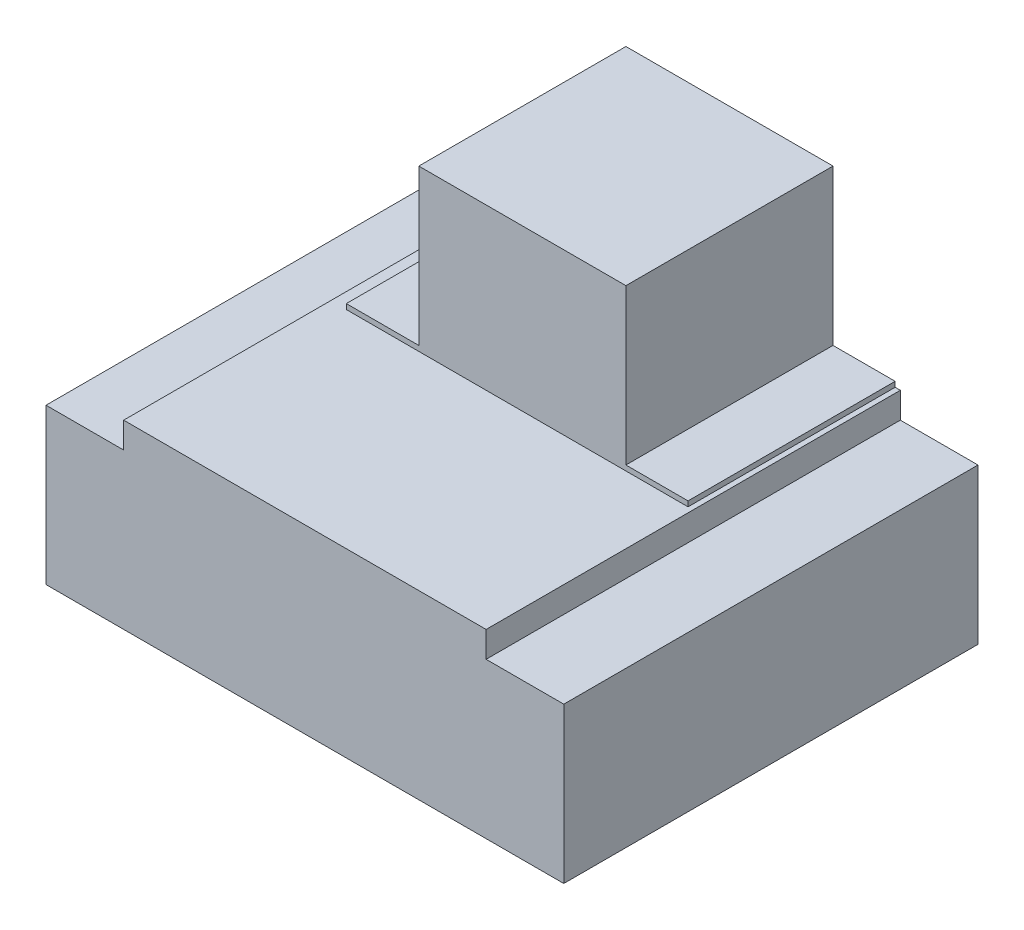
ISO-10303-21;
HEADER;
FILE_DESCRIPTION(('STEP AP214'),'2;1');
FILE_NAME('part.step','',(''),(''),'','','');
FILE_SCHEMA(('AUTOMOTIVE_DESIGN { 1 0 10303 214 1 1 1 1 }'));
ENDSEC;
DATA;
#1=APPLICATION_CONTEXT('core data for automotive mechanical design processes');
#2=APPLICATION_PROTOCOL_DEFINITION('international standard','automotive_design',2000,#1);
#3=PRODUCT_CONTEXT('',#1,'mechanical');
#4=PRODUCT('Part','Part','',(#3));
#5=PRODUCT_RELATED_PRODUCT_CATEGORY('part','',(#4));
#6=PRODUCT_DEFINITION_FORMATION('','',#4);
#7=PRODUCT_DEFINITION_CONTEXT('part definition',#1,'design');
#8=PRODUCT_DEFINITION('design','',#6,#7);
#9=PRODUCT_DEFINITION_SHAPE('','',#8);
#10=(LENGTH_UNIT() NAMED_UNIT(*) SI_UNIT(.MILLI.,.METRE.));
#11=(NAMED_UNIT(*) PLANE_ANGLE_UNIT() SI_UNIT($,.RADIAN.));
#12=(NAMED_UNIT(*) SI_UNIT($,.STERADIAN.) SOLID_ANGLE_UNIT());
#13=UNCERTAINTY_MEASURE_WITH_UNIT(LENGTH_MEASURE(1.E-05),#10,'distance_accuracy_value','');
#14=(GEOMETRIC_REPRESENTATION_CONTEXT(3) GLOBAL_UNCERTAINTY_ASSIGNED_CONTEXT((#13)) GLOBAL_UNIT_ASSIGNED_CONTEXT((#10,
#11,#12)) REPRESENTATION_CONTEXT('',''));
#15=CARTESIAN_POINT('',(0.,0.,0.));
#16=DIRECTION('',(0.,0.,1.));
#17=DIRECTION('',(1.,0.,0.));
#18=AXIS2_PLACEMENT_3D('',#15,#16,#17);
#19=CARTESIAN_POINT('',(0.,35.,0.));
#20=DIRECTION('',(1.,0.,0.));
#21=DIRECTION('',(0.,0.,-1.));
#22=AXIS2_PLACEMENT_3D('',#19,#20,#21);
#23=PLANE('',#22);
#24=DIRECTION('',(0.,0.,1.));
#25=VECTOR('',#24,1.);
#26=CARTESIAN_POINT('',(0.,30.,-80.));
#27=LINE('',#26,#25);
#28=CARTESIAN_POINT('',(0.,30.,-80.));
#29=VERTEX_POINT('',#28);
#30=CARTESIAN_POINT('',(0.,30.,0.));
#31=VERTEX_POINT('',#30);
#32=EDGE_CURVE('E145',#29,#31,#27,.T.);
#33=ORIENTED_EDGE('',*,*,#32,.F.);
#34=DIRECTION('',(0.,-1.,0.));
#35=VECTOR('',#34,1.);
#36=CARTESIAN_POINT('',(0.,35.,-80.));
#37=LINE('',#36,#35);
#38=CARTESIAN_POINT('',(0.,0.,-80.));
#39=VERTEX_POINT('',#38);
#40=EDGE_CURVE('E167',#29,#39,#37,.T.);
#41=ORIENTED_EDGE('',*,*,#40,.T.);
#42=DIRECTION('',(0.,0.,1.));
#43=VECTOR('',#42,1.);
#44=CARTESIAN_POINT('',(0.,0.,0.));
#45=LINE('',#44,#43);
#46=CARTESIAN_POINT('',(0.,0.,0.));
#47=VERTEX_POINT('',#46);
#48=EDGE_CURVE('E166',#39,#47,#45,.T.);
#49=ORIENTED_EDGE('',*,*,#48,.T.);
#50=DIRECTION('',(0.,-1.,0.));
#51=VECTOR('',#50,1.);
#52=CARTESIAN_POINT('',(0.,35.,0.));
#53=LINE('',#52,#51);
#54=EDGE_CURVE('E11',#31,#47,#53,.T.);
#55=ORIENTED_EDGE('',*,*,#54,.F.);
#56=EDGE_LOOP('',(#33,#41,#49,#55));
#57=FACE_BOUND('',#56,.T.);
#58=ADVANCED_FACE('F35',(#57),#23,.F.);
#59=CARTESIAN_POINT('',(0.,36.,0.));
#60=DIRECTION('',(0.,1.,0.));
#61=DIRECTION('',(0.,0.,1.));
#62=AXIS2_PLACEMENT_3D('',#59,#60,#61);
#63=PLANE('',#62);
#64=DIRECTION('',(0.,0.,1.));
#65=VECTOR('',#64,1.);
#66=CARTESIAN_POINT('',(32.,36.,-80.));
#67=LINE('',#66,#65);
#68=CARTESIAN_POINT('',(32.,36.,-80.));
#69=VERTEX_POINT('',#68);
#70=CARTESIAN_POINT('',(32.,36.,-40.));
#71=VERTEX_POINT('',#70);
#72=EDGE_CURVE('E229',#69,#71,#67,.T.);
#73=ORIENTED_EDGE('',*,*,#72,.F.);
#74=DIRECTION('',(-1.,0.,0.));
#75=VECTOR('',#74,1.);
#76=CARTESIAN_POINT('',(18.,36.,-80.));
#77=LINE('',#76,#75);
#78=CARTESIAN_POINT('',(18.,36.,-80.));
#79=VERTEX_POINT('',#78);
#80=EDGE_CURVE('E256',#69,#79,#77,.T.);
#81=ORIENTED_EDGE('',*,*,#80,.T.);
#82=DIRECTION('',(0.,0.,1.));
#83=VECTOR('',#82,1.);
#84=CARTESIAN_POINT('',(18.,36.,-80.));
#85=LINE('',#84,#83);
#86=CARTESIAN_POINT('',(18.,36.,-40.));
#87=VERTEX_POINT('',#86);
#88=EDGE_CURVE('E247',#79,#87,#85,.T.);
#89=ORIENTED_EDGE('',*,*,#88,.T.);
#90=DIRECTION('',(1.,0.,0.));
#91=VECTOR('',#90,1.);
#92=CARTESIAN_POINT('',(18.,36.,-40.));
#93=LINE('',#92,#91);
#94=EDGE_CURVE('E252',#87,#71,#93,.T.);
#95=ORIENTED_EDGE('',*,*,#94,.T.);
#96=EDGE_LOOP('',(#73,#81,#89,#95));
#97=FACE_BOUND('',#96,.T.);
#98=ADVANCED_FACE('F306',(#97),#63,.T.);
#99=CARTESIAN_POINT('',(0.,35.,0.));
#100=DIRECTION('',(0.,-1.,0.));
#101=DIRECTION('',(0.,0.,-1.));
#102=AXIS2_PLACEMENT_3D('',#99,#100,#101);
#103=PLANE('',#102);
#104=DIRECTION('',(-1.,0.,0.));
#105=VECTOR('',#104,1.);
#106=CARTESIAN_POINT('',(0.,35.,-80.));
#107=LINE('',#106,#105);
#108=CARTESIAN_POINT('',(18.,35.,-80.));
#109=VERTEX_POINT('',#108);
#110=CARTESIAN_POINT('',(15.,35.,-80.));
#111=VERTEX_POINT('',#110);
#112=EDGE_CURVE('E274',#109,#111,#107,.T.);
#113=ORIENTED_EDGE('',*,*,#112,.T.);
#114=DIRECTION('',(0.,0.,-1.));
#115=VECTOR('',#114,1.);
#116=CARTESIAN_POINT('',(15.,35.,-80.));
#117=LINE('',#116,#115);
#118=CARTESIAN_POINT('',(15.,35.,0.));
#119=VERTEX_POINT('',#118);
#120=EDGE_CURVE('E155',#119,#111,#117,.T.);
#121=ORIENTED_EDGE('',*,*,#120,.F.);
#122=DIRECTION('',(1.,0.,0.));
#123=VECTOR('',#122,1.);
#124=CARTESIAN_POINT('',(0.,35.,0.));
#125=LINE('',#124,#123);
#126=CARTESIAN_POINT('',(85.,35.,0.));
#127=VERTEX_POINT('',#126);
#128=EDGE_CURVE('E187',#119,#127,#125,.T.);
#129=ORIENTED_EDGE('',*,*,#128,.T.);
#130=DIRECTION('',(0.,0.,1.));
#131=VECTOR('',#130,1.);
#132=CARTESIAN_POINT('',(85.,35.,-80.));
#133=LINE('',#132,#131);
#134=CARTESIAN_POINT('',(85.,35.,-80.));
#135=VERTEX_POINT('',#134);
#136=EDGE_CURVE('E208',#135,#127,#133,.T.);
#137=ORIENTED_EDGE('',*,*,#136,.F.);
#138=CARTESIAN_POINT('',(84.,35.,-80.));
#139=VERTEX_POINT('',#138);
#140=EDGE_CURVE('E180',#135,#139,#107,.T.);
#141=ORIENTED_EDGE('',*,*,#140,.T.);
#142=DIRECTION('',(0.,0.,-1.));
#143=VECTOR('',#142,1.);
#144=CARTESIAN_POINT('',(84.,35.,-80.));
#145=LINE('',#144,#143);
#146=CARTESIAN_POINT('',(84.,35.,-40.));
#147=VERTEX_POINT('',#146);
#148=EDGE_CURVE('E251',#147,#139,#145,.T.);
#149=ORIENTED_EDGE('',*,*,#148,.F.);
#150=DIRECTION('',(1.,0.,0.));
#151=VECTOR('',#150,1.);
#152=CARTESIAN_POINT('',(18.,35.,-40.));
#153=LINE('',#152,#151);
#154=CARTESIAN_POINT('',(18.,35.,-40.));
#155=VERTEX_POINT('',#154);
#156=EDGE_CURVE('E262',#155,#147,#153,.T.);
#157=ORIENTED_EDGE('',*,*,#156,.F.);
#158=DIRECTION('',(0.,0.,1.));
#159=VECTOR('',#158,1.);
#160=CARTESIAN_POINT('',(18.,35.,-80.));
#161=LINE('',#160,#159);
#162=EDGE_CURVE('E246',#109,#155,#161,.T.);
#163=ORIENTED_EDGE('',*,*,#162,.F.);
#164=EDGE_LOOP('',(#113,#121,#129,#137,#141,#149,#157,#163));
#165=FACE_BOUND('',#164,.T.);
#166=ADVANCED_FACE('F280',(#165),#103,.F.);
#167=CARTESIAN_POINT('',(0.,35.,0.));
#168=DIRECTION('',(0.,0.,-1.));
#169=DIRECTION('',(-1.,0.,0.));
#170=AXIS2_PLACEMENT_3D('',#167,#168,#169);
#171=PLANE('',#170);
#172=ORIENTED_EDGE('',*,*,#128,.F.);
#173=DIRECTION('',(0.,1.,0.));
#174=VECTOR('',#173,1.);
#175=CARTESIAN_POINT('',(15.,30.,0.));
#176=LINE('',#175,#174);
#177=CARTESIAN_POINT('',(15.,30.,0.));
#178=VERTEX_POINT('',#177);
#179=EDGE_CURVE('E162',#178,#119,#176,.T.);
#180=ORIENTED_EDGE('',*,*,#179,.F.);
#181=DIRECTION('',(1.,0.,0.));
#182=VECTOR('',#181,1.);
#183=CARTESIAN_POINT('',(0.,30.,0.));
#184=LINE('',#183,#182);
#185=EDGE_CURVE('E148',#31,#178,#184,.T.);
#186=ORIENTED_EDGE('',*,*,#185,.F.);
#187=ORIENTED_EDGE('',*,*,#54,.T.);
#188=DIRECTION('',(1.,0.,0.));
#189=VECTOR('',#188,1.);
#190=CARTESIAN_POINT('',(0.,0.,0.));
#191=LINE('',#190,#189);
#192=CARTESIAN_POINT('',(100.,0.,0.));
#193=VERTEX_POINT('',#192);
#194=EDGE_CURVE('E171',#47,#193,#191,.T.);
#195=ORIENTED_EDGE('',*,*,#194,.T.);
#196=DIRECTION('',(0.,-1.,0.));
#197=VECTOR('',#196,1.);
#198=CARTESIAN_POINT('',(100.,35.,0.));
#199=LINE('',#198,#197);
#200=CARTESIAN_POINT('',(100.,30.,0.));
#201=VERTEX_POINT('',#200);
#202=EDGE_CURVE('E42',#201,#193,#199,.T.);
#203=ORIENTED_EDGE('',*,*,#202,.F.);
#204=DIRECTION('',(1.,0.,0.));
#205=VECTOR('',#204,1.);
#206=CARTESIAN_POINT('',(100.,30.,0.));
#207=LINE('',#206,#205);
#208=CARTESIAN_POINT('',(85.,30.,0.));
#209=VERTEX_POINT('',#208);
#210=EDGE_CURVE('E206',#209,#201,#207,.T.);
#211=ORIENTED_EDGE('',*,*,#210,.F.);
#212=DIRECTION('',(0.,1.,0.));
#213=VECTOR('',#212,1.);
#214=CARTESIAN_POINT('',(85.,30.,0.));
#215=LINE('',#214,#213);
#216=EDGE_CURVE('E214',#209,#127,#215,.T.);
#217=ORIENTED_EDGE('',*,*,#216,.T.);
#218=EDGE_LOOP('',(#172,#180,#186,#187,#195,#203,#211,#217));
#219=FACE_BOUND('',#218,.T.);
#220=ADVANCED_FACE('F159',(#219),#171,.F.);
#221=CARTESIAN_POINT('',(100.,35.,0.));
#222=DIRECTION('',(-1.,0.,0.));
#223=DIRECTION('',(0.,0.,1.));
#224=AXIS2_PLACEMENT_3D('',#221,#222,#223);
#225=PLANE('',#224);
#226=DIRECTION('',(0.,-1.,0.));
#227=VECTOR('',#226,1.);
#228=CARTESIAN_POINT('',(100.,35.,-80.));
#229=LINE('',#228,#227);
#230=CARTESIAN_POINT('',(100.,30.,-80.));
#231=VERTEX_POINT('',#230);
#232=CARTESIAN_POINT('',(100.,0.,-80.));
#233=VERTEX_POINT('',#232);
#234=EDGE_CURVE('E189',#231,#233,#229,.T.);
#235=ORIENTED_EDGE('',*,*,#234,.F.);
#236=DIRECTION('',(0.,0.,-1.));
#237=VECTOR('',#236,1.);
#238=CARTESIAN_POINT('',(100.,30.,-80.));
#239=LINE('',#238,#237);
#240=EDGE_CURVE('E57',#201,#231,#239,.T.);
#241=ORIENTED_EDGE('',*,*,#240,.F.);
#242=ORIENTED_EDGE('',*,*,#202,.T.);
#243=DIRECTION('',(0.,0.,-1.));
#244=VECTOR('',#243,1.);
#245=CARTESIAN_POINT('',(100.,0.,0.));
#246=LINE('',#245,#244);
#247=EDGE_CURVE('E174',#193,#233,#246,.T.);
#248=ORIENTED_EDGE('',*,*,#247,.T.);
#249=EDGE_LOOP('',(#235,#241,#242,#248));
#250=FACE_BOUND('',#249,.T.);
#251=ADVANCED_FACE('F193',(#250),#225,.F.);
#252=CARTESIAN_POINT('',(0.,35.,-80.));
#253=DIRECTION('',(0.,0.,1.));
#254=DIRECTION('',(1.,0.,0.));
#255=AXIS2_PLACEMENT_3D('',#252,#253,#254);
#256=PLANE('',#255);
#257=DIRECTION('',(-1.,0.,0.));
#258=VECTOR('',#257,1.);
#259=CARTESIAN_POINT('',(0.,30.,-80.));
#260=LINE('',#259,#258);
#261=CARTESIAN_POINT('',(15.,30.,-80.));
#262=VERTEX_POINT('',#261);
#263=EDGE_CURVE('E151',#262,#29,#260,.T.);
#264=ORIENTED_EDGE('',*,*,#263,.F.);
#265=DIRECTION('',(0.,1.,0.));
#266=VECTOR('',#265,1.);
#267=CARTESIAN_POINT('',(15.,30.,-80.));
#268=LINE('',#267,#266);
#269=EDGE_CURVE('E232',#262,#111,#268,.T.);
#270=ORIENTED_EDGE('',*,*,#269,.T.);
#271=ORIENTED_EDGE('',*,*,#112,.F.);
#272=DIRECTION('',(0.,-1.,0.));
#273=VECTOR('',#272,1.);
#274=CARTESIAN_POINT('',(18.,36.,-80.));
#275=LINE('',#274,#273);
#276=EDGE_CURVE('E259',#79,#109,#275,.T.);
#277=ORIENTED_EDGE('',*,*,#276,.F.);
#278=ORIENTED_EDGE('',*,*,#80,.F.);
#279=DIRECTION('',(0.,-1.,0.));
#280=VECTOR('',#279,1.);
#281=CARTESIAN_POINT('',(32.,66.,-80.));
#282=LINE('',#281,#280);
#283=CARTESIAN_POINT('',(32.,66.,-80.));
#284=VERTEX_POINT('',#283);
#285=EDGE_CURVE('E228',#284,#69,#282,.T.);
#286=ORIENTED_EDGE('',*,*,#285,.F.);
#287=DIRECTION('',(-1.,0.,0.));
#288=VECTOR('',#287,1.);
#289=CARTESIAN_POINT('',(32.,66.,-80.));
#290=LINE('',#289,#288);
#291=CARTESIAN_POINT('',(72.,66.,-80.));
#292=VERTEX_POINT('',#291);
#293=EDGE_CURVE('E226',#292,#284,#290,.T.);
#294=ORIENTED_EDGE('',*,*,#293,.F.);
#295=DIRECTION('',(0.,-1.,0.));
#296=VECTOR('',#295,1.);
#297=CARTESIAN_POINT('',(72.,66.,-80.));
#298=LINE('',#297,#296);
#299=CARTESIAN_POINT('',(72.,36.,-80.));
#300=VERTEX_POINT('',#299);
#301=EDGE_CURVE('E237',#292,#300,#298,.T.);
#302=ORIENTED_EDGE('',*,*,#301,.T.);
#303=CARTESIAN_POINT('',(84.,36.,-80.));
#304=VERTEX_POINT('',#303);
#305=EDGE_CURVE('E257',#304,#300,#77,.T.);
#306=ORIENTED_EDGE('',*,*,#305,.F.);
#307=DIRECTION('',(0.,-1.,0.));
#308=VECTOR('',#307,1.);
#309=CARTESIAN_POINT('',(84.,36.,-80.));
#310=LINE('',#309,#308);
#311=EDGE_CURVE('E269',#304,#139,#310,.T.);
#312=ORIENTED_EDGE('',*,*,#311,.T.);
#313=ORIENTED_EDGE('',*,*,#140,.F.);
#314=DIRECTION('',(0.,1.,0.));
#315=VECTOR('',#314,1.);
#316=CARTESIAN_POINT('',(85.,30.,-80.));
#317=LINE('',#316,#315);
#318=CARTESIAN_POINT('',(85.,30.,-80.));
#319=VERTEX_POINT('',#318);
#320=EDGE_CURVE('E202',#319,#135,#317,.T.);
#321=ORIENTED_EDGE('',*,*,#320,.F.);
#322=DIRECTION('',(-1.,0.,0.));
#323=VECTOR('',#322,1.);
#324=CARTESIAN_POINT('',(100.,30.,-80.));
#325=LINE('',#324,#323);
#326=EDGE_CURVE('E200',#231,#319,#325,.T.);
#327=ORIENTED_EDGE('',*,*,#326,.F.);
#328=ORIENTED_EDGE('',*,*,#234,.T.);
#329=DIRECTION('',(-1.,0.,0.));
#330=VECTOR('',#329,1.);
#331=CARTESIAN_POINT('',(0.,0.,-80.));
#332=LINE('',#331,#330);
#333=EDGE_CURVE('E185',#233,#39,#332,.T.);
#334=ORIENTED_EDGE('',*,*,#333,.T.);
#335=ORIENTED_EDGE('',*,*,#40,.F.);
#336=EDGE_LOOP('',(#264,#270,#271,#277,#278,#286,#294,#302,#306,#312,#313,#321,#327,#328,#334,#335));
#337=FACE_BOUND('',#336,.T.);
#338=ADVANCED_FACE('F198',(#337),#256,.F.);
#339=CARTESIAN_POINT('',(0.,0.,0.));
#340=DIRECTION('',(0.,-1.,0.));
#341=DIRECTION('',(0.,0.,-1.));
#342=AXIS2_PLACEMENT_3D('',#339,#340,#341);
#343=PLANE('',#342);
#344=ORIENTED_EDGE('',*,*,#48,.F.);
#345=ORIENTED_EDGE('',*,*,#333,.F.);
#346=ORIENTED_EDGE('',*,*,#247,.F.);
#347=ORIENTED_EDGE('',*,*,#194,.F.);
#348=EDGE_LOOP('',(#344,#345,#346,#347));
#349=FACE_BOUND('',#348,.T.);
#350=ADVANCED_FACE('F196',(#349),#343,.T.);
#351=CARTESIAN_POINT('',(18.,36.,-80.));
#352=DIRECTION('',(1.,0.,0.));
#353=DIRECTION('',(0.,0.,-1.));
#354=AXIS2_PLACEMENT_3D('',#351,#352,#353);
#355=PLANE('',#354);
#356=ORIENTED_EDGE('',*,*,#162,.T.);
#357=DIRECTION('',(0.,-1.,0.));
#358=VECTOR('',#357,1.);
#359=CARTESIAN_POINT('',(18.,36.,-40.));
#360=LINE('',#359,#358);
#361=EDGE_CURVE('E172',#87,#155,#360,.T.);
#362=ORIENTED_EDGE('',*,*,#361,.F.);
#363=ORIENTED_EDGE('',*,*,#88,.F.);
#364=ORIENTED_EDGE('',*,*,#276,.T.);
#365=EDGE_LOOP('',(#356,#362,#363,#364));
#366=FACE_BOUND('',#365,.T.);
#367=ADVANCED_FACE('F304',(#366),#355,.F.);
#368=CARTESIAN_POINT('',(18.,36.,-40.));
#369=DIRECTION('',(0.,0.,-1.));
#370=DIRECTION('',(-1.,0.,0.));
#371=AXIS2_PLACEMENT_3D('',#368,#369,#370);
#372=PLANE('',#371);
#373=ORIENTED_EDGE('',*,*,#156,.T.);
#374=DIRECTION('',(0.,-1.,0.));
#375=VECTOR('',#374,1.);
#376=CARTESIAN_POINT('',(84.,36.,-40.));
#377=LINE('',#376,#375);
#378=CARTESIAN_POINT('',(84.,36.,-40.));
#379=VERTEX_POINT('',#378);
#380=EDGE_CURVE('E177',#379,#147,#377,.T.);
#381=ORIENTED_EDGE('',*,*,#380,.F.);
#382=CARTESIAN_POINT('',(72.,36.,-40.));
#383=VERTEX_POINT('',#382);
#384=EDGE_CURVE('E250',#383,#379,#93,.T.);
#385=ORIENTED_EDGE('',*,*,#384,.F.);
#386=DIRECTION('',(0.,-1.,0.));
#387=VECTOR('',#386,1.);
#388=CARTESIAN_POINT('',(72.,66.,-40.));
#389=LINE('',#388,#387);
#390=CARTESIAN_POINT('',(72.,66.,-40.));
#391=VERTEX_POINT('',#390);
#392=EDGE_CURVE('E240',#391,#383,#389,.T.);
#393=ORIENTED_EDGE('',*,*,#392,.F.);
#394=DIRECTION('',(1.,0.,0.));
#395=VECTOR('',#394,1.);
#396=CARTESIAN_POINT('',(32.,66.,-40.));
#397=LINE('',#396,#395);
#398=CARTESIAN_POINT('',(32.,66.,-40.));
#399=VERTEX_POINT('',#398);
#400=EDGE_CURVE('E221',#399,#391,#397,.T.);
#401=ORIENTED_EDGE('',*,*,#400,.F.);
#402=DIRECTION('',(0.,-1.,0.));
#403=VECTOR('',#402,1.);
#404=CARTESIAN_POINT('',(32.,66.,-40.));
#405=LINE('',#404,#403);
#406=EDGE_CURVE('E243',#399,#71,#405,.T.);
#407=ORIENTED_EDGE('',*,*,#406,.T.);
#408=ORIENTED_EDGE('',*,*,#94,.F.);
#409=ORIENTED_EDGE('',*,*,#361,.T.);
#410=EDGE_LOOP('',(#373,#381,#385,#393,#401,#407,#408,#409));
#411=FACE_BOUND('',#410,.T.);
#412=ADVANCED_FACE('F297',(#411),#372,.F.);
#413=CARTESIAN_POINT('',(84.,36.,-80.));
#414=DIRECTION('',(-1.,0.,0.));
#415=DIRECTION('',(0.,0.,1.));
#416=AXIS2_PLACEMENT_3D('',#413,#414,#415);
#417=PLANE('',#416);
#418=ORIENTED_EDGE('',*,*,#148,.T.);
#419=ORIENTED_EDGE('',*,*,#311,.F.);
#420=DIRECTION('',(0.,0.,-1.));
#421=VECTOR('',#420,1.);
#422=CARTESIAN_POINT('',(84.,36.,-80.));
#423=LINE('',#422,#421);
#424=EDGE_CURVE('E254',#379,#304,#423,.T.);
#425=ORIENTED_EDGE('',*,*,#424,.F.);
#426=ORIENTED_EDGE('',*,*,#380,.T.);
#427=EDGE_LOOP('',(#418,#419,#425,#426));
#428=FACE_BOUND('',#427,.T.);
#429=ADVANCED_FACE('F283',(#428),#417,.F.);
#430=DIRECTION('',(0.,0.,-1.));
#431=VECTOR('',#430,1.);
#432=CARTESIAN_POINT('',(72.,36.,-80.));
#433=LINE('',#432,#431);
#434=EDGE_CURVE('E222',#383,#300,#433,.T.);
#435=ORIENTED_EDGE('',*,*,#434,.F.);
#436=ORIENTED_EDGE('',*,*,#384,.T.);
#437=ORIENTED_EDGE('',*,*,#424,.T.);
#438=ORIENTED_EDGE('',*,*,#305,.T.);
#439=EDGE_LOOP('',(#435,#436,#437,#438));
#440=FACE_BOUND('',#439,.T.);
#441=ADVANCED_FACE('F290',(#440),#63,.T.);
#442=CARTESIAN_POINT('',(32.,66.,-80.));
#443=DIRECTION('',(1.,0.,0.));
#444=DIRECTION('',(0.,0.,-1.));
#445=AXIS2_PLACEMENT_3D('',#442,#443,#444);
#446=PLANE('',#445);
#447=ORIENTED_EDGE('',*,*,#72,.T.);
#448=ORIENTED_EDGE('',*,*,#406,.F.);
#449=DIRECTION('',(0.,0.,1.));
#450=VECTOR('',#449,1.);
#451=CARTESIAN_POINT('',(32.,66.,-80.));
#452=LINE('',#451,#450);
#453=EDGE_CURVE('E218',#284,#399,#452,.T.);
#454=ORIENTED_EDGE('',*,*,#453,.F.);
#455=ORIENTED_EDGE('',*,*,#285,.T.);
#456=EDGE_LOOP('',(#447,#448,#454,#455));
#457=FACE_BOUND('',#456,.T.);
#458=ADVANCED_FACE('F310',(#457),#446,.F.);
#459=CARTESIAN_POINT('',(72.,66.,-80.));
#460=DIRECTION('',(-1.,0.,0.));
#461=DIRECTION('',(0.,0.,1.));
#462=AXIS2_PLACEMENT_3D('',#459,#460,#461);
#463=PLANE('',#462);
#464=ORIENTED_EDGE('',*,*,#434,.T.);
#465=ORIENTED_EDGE('',*,*,#301,.F.);
#466=DIRECTION('',(0.,0.,-1.));
#467=VECTOR('',#466,1.);
#468=CARTESIAN_POINT('',(72.,66.,-80.));
#469=LINE('',#468,#467);
#470=EDGE_CURVE('E224',#391,#292,#469,.T.);
#471=ORIENTED_EDGE('',*,*,#470,.F.);
#472=ORIENTED_EDGE('',*,*,#392,.T.);
#473=EDGE_LOOP('',(#464,#465,#471,#472));
#474=FACE_BOUND('',#473,.T.);
#475=ADVANCED_FACE('F293',(#474),#463,.F.);
#476=CARTESIAN_POINT('',(0.,66.,0.));
#477=DIRECTION('',(0.,1.,0.));
#478=DIRECTION('',(0.,0.,1.));
#479=AXIS2_PLACEMENT_3D('',#476,#477,#478);
#480=PLANE('',#479);
#481=ORIENTED_EDGE('',*,*,#453,.T.);
#482=ORIENTED_EDGE('',*,*,#400,.T.);
#483=ORIENTED_EDGE('',*,*,#470,.T.);
#484=ORIENTED_EDGE('',*,*,#293,.T.);
#485=EDGE_LOOP('',(#481,#482,#483,#484));
#486=FACE_BOUND('',#485,.T.);
#487=ADVANCED_FACE('F313',(#486),#480,.T.);
#488=CARTESIAN_POINT('',(85.,30.,-80.));
#489=DIRECTION('',(-1.,0.,0.));
#490=DIRECTION('',(0.,0.,1.));
#491=AXIS2_PLACEMENT_3D('',#488,#489,#490);
#492=PLANE('',#491);
#493=ORIENTED_EDGE('',*,*,#136,.T.);
#494=ORIENTED_EDGE('',*,*,#216,.F.);
#495=DIRECTION('',(0.,0.,1.));
#496=VECTOR('',#495,1.);
#497=CARTESIAN_POINT('',(85.,30.,-80.));
#498=LINE('',#497,#496);
#499=EDGE_CURVE('E204',#319,#209,#498,.T.);
#500=ORIENTED_EDGE('',*,*,#499,.F.);
#501=ORIENTED_EDGE('',*,*,#320,.T.);
#502=EDGE_LOOP('',(#493,#494,#500,#501));
#503=FACE_BOUND('',#502,.T.);
#504=ADVANCED_FACE('F315',(#503),#492,.F.);
#505=CARTESIAN_POINT('',(0.,30.,0.));
#506=DIRECTION('',(0.,-1.,0.));
#507=DIRECTION('',(0.,0.,-1.));
#508=AXIS2_PLACEMENT_3D('',#505,#506,#507);
#509=PLANE('',#508);
#510=ORIENTED_EDGE('',*,*,#240,.T.);
#511=ORIENTED_EDGE('',*,*,#326,.T.);
#512=ORIENTED_EDGE('',*,*,#499,.T.);
#513=ORIENTED_EDGE('',*,*,#210,.T.);
#514=EDGE_LOOP('',(#510,#511,#512,#513));
#515=FACE_BOUND('',#514,.T.);
#516=ADVANCED_FACE('F321',(#515),#509,.F.);
#517=CARTESIAN_POINT('',(15.,30.,-80.));
#518=DIRECTION('',(1.,0.,0.));
#519=DIRECTION('',(0.,0.,-1.));
#520=AXIS2_PLACEMENT_3D('',#517,#518,#519);
#521=PLANE('',#520);
#522=ORIENTED_EDGE('',*,*,#120,.T.);
#523=ORIENTED_EDGE('',*,*,#269,.F.);
#524=DIRECTION('',(0.,0.,-1.));
#525=VECTOR('',#524,1.);
#526=CARTESIAN_POINT('',(15.,30.,-80.));
#527=LINE('',#526,#525);
#528=EDGE_CURVE('E49',#178,#262,#527,.T.);
#529=ORIENTED_EDGE('',*,*,#528,.F.);
#530=ORIENTED_EDGE('',*,*,#179,.T.);
#531=EDGE_LOOP('',(#522,#523,#529,#530));
#532=FACE_BOUND('',#531,.T.);
#533=ADVANCED_FACE('F448',(#532),#521,.F.);
#534=CARTESIAN_POINT('',(0.,30.,0.));
#535=DIRECTION('',(0.,1.,0.));
#536=DIRECTION('',(0.,0.,1.));
#537=AXIS2_PLACEMENT_3D('',#534,#535,#536);
#538=PLANE('',#537);
#539=ORIENTED_EDGE('',*,*,#32,.T.);
#540=ORIENTED_EDGE('',*,*,#185,.T.);
#541=ORIENTED_EDGE('',*,*,#528,.T.);
#542=ORIENTED_EDGE('',*,*,#263,.T.);
#543=EDGE_LOOP('',(#539,#540,#541,#542));
#544=FACE_BOUND('',#543,.T.);
#545=ADVANCED_FACE('F147',(#544),#538,.T.);
#546=CLOSED_SHELL('',(#58,#98,#166,#220,#251,#338,#350,#367,#412,#429,#441,#458,#475,#487,#504,
#516,#533,#545));
#547=MANIFOLD_SOLID_BREP('B2',#546);
#548=ADVANCED_BREP_SHAPE_REPRESENTATION('',(#18,#547),#14);
#549=SHAPE_DEFINITION_REPRESENTATION(#9,#548);
ENDSEC;
END-ISO-10303-21;
